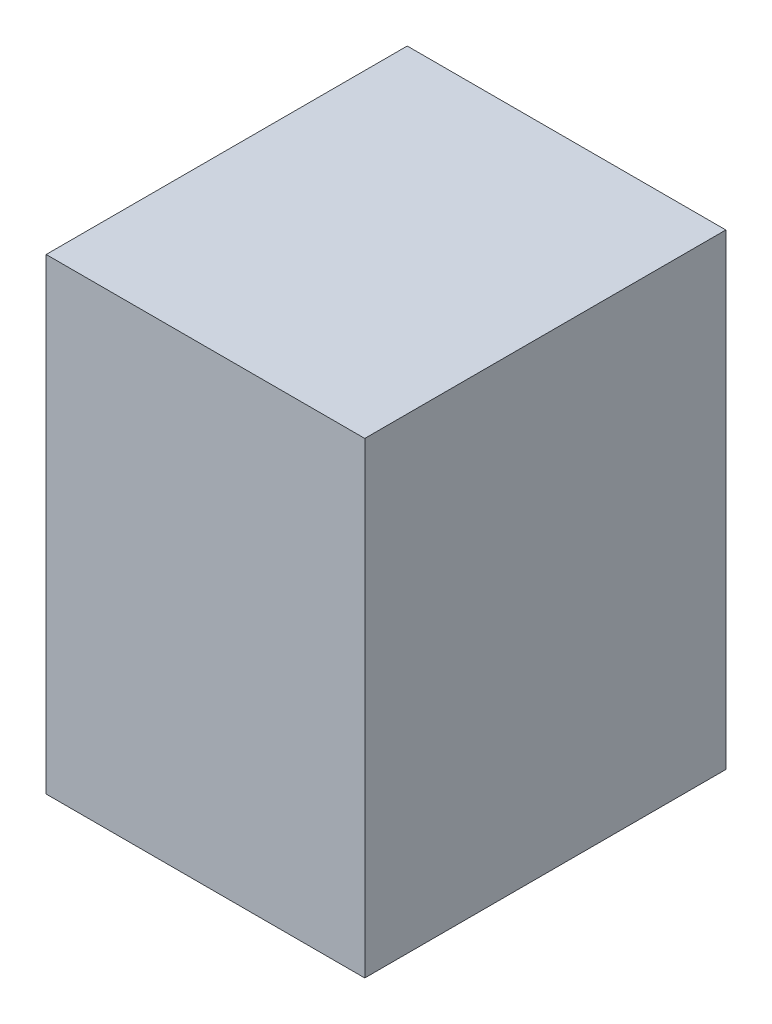
ISO-10303-21;
HEADER;
FILE_DESCRIPTION(('STEP AP214'),'2;1');
FILE_NAME('part.step','',(''),(''),'','','');
FILE_SCHEMA(('AUTOMOTIVE_DESIGN { 1 0 10303 214 1 1 1 1 }'));
ENDSEC;
DATA;
#1=APPLICATION_CONTEXT('core data for automotive mechanical design processes');
#2=APPLICATION_PROTOCOL_DEFINITION('international standard','automotive_design',2000,#1);
#3=PRODUCT_CONTEXT('',#1,'mechanical');
#4=PRODUCT('Part','Part','',(#3));
#5=PRODUCT_RELATED_PRODUCT_CATEGORY('part','',(#4));
#6=PRODUCT_DEFINITION_FORMATION('','',#4);
#7=PRODUCT_DEFINITION_CONTEXT('part definition',#1,'design');
#8=PRODUCT_DEFINITION('design','',#6,#7);
#9=PRODUCT_DEFINITION_SHAPE('','',#8);
#10=(LENGTH_UNIT() NAMED_UNIT(*) SI_UNIT(.MILLI.,.METRE.));
#11=(NAMED_UNIT(*) PLANE_ANGLE_UNIT() SI_UNIT($,.RADIAN.));
#12=(NAMED_UNIT(*) SI_UNIT($,.STERADIAN.) SOLID_ANGLE_UNIT());
#13=UNCERTAINTY_MEASURE_WITH_UNIT(LENGTH_MEASURE(1.E-05),#10,'distance_accuracy_value','');
#14=(GEOMETRIC_REPRESENTATION_CONTEXT(3) GLOBAL_UNCERTAINTY_ASSIGNED_CONTEXT((#13)) GLOBAL_UNIT_ASSIGNED_CONTEXT((#10,
#11,#12)) REPRESENTATION_CONTEXT('',''));
#15=CARTESIAN_POINT('',(0.,0.,0.));
#16=DIRECTION('',(0.,0.,1.));
#17=DIRECTION('',(1.,0.,0.));
#18=AXIS2_PLACEMENT_3D('',#15,#16,#17);
#19=CARTESIAN_POINT('',(38.1,55.88,14.6419390581718));
#20=DIRECTION('',(0.,0.,-1.));
#21=DIRECTION('',(0.,1.,0.));
#22=AXIS2_PLACEMENT_3D('',#19,#20,#21);
#23=PLANE('',#22);
#24=DIRECTION('',(0.,-1.,0.));
#25=VECTOR('',#24,1.);
#26=CARTESIAN_POINT('',(0.,55.88,14.6419390581718));
#27=LINE('',#26,#25);
#28=CARTESIAN_POINT('',(0.,55.88,14.6419390581718));
#29=VERTEX_POINT('',#28);
#30=CARTESIAN_POINT('',(0.,0.,14.6419390581718));
#31=VERTEX_POINT('',#30);
#32=EDGE_CURVE('E100',#29,#31,#27,.T.);
#33=ORIENTED_EDGE('',*,*,#32,.T.);
#34=DIRECTION('',(-1.,0.,0.));
#35=VECTOR('',#34,1.);
#36=CARTESIAN_POINT('',(38.1,0.,14.6419390581718));
#37=LINE('',#36,#35);
#38=CARTESIAN_POINT('',(38.1,0.,14.6419390581718));
#39=VERTEX_POINT('',#38);
#40=EDGE_CURVE('E11',#39,#31,#37,.T.);
#41=ORIENTED_EDGE('',*,*,#40,.F.);
#42=DIRECTION('',(0.,-1.,0.));
#43=VECTOR('',#42,1.);
#44=CARTESIAN_POINT('',(38.1,55.88,14.6419390581718));
#45=LINE('',#44,#43);
#46=CARTESIAN_POINT('',(38.1,55.88,14.6419390581718));
#47=VERTEX_POINT('',#46);
#48=EDGE_CURVE('E88',#47,#39,#45,.T.);
#49=ORIENTED_EDGE('',*,*,#48,.F.);
#50=DIRECTION('',(-1.,0.,0.));
#51=VECTOR('',#50,1.);
#52=CARTESIAN_POINT('',(38.1,55.88,14.6419390581718));
#53=LINE('',#52,#51);
#54=EDGE_CURVE('E96',#47,#29,#53,.T.);
#55=ORIENTED_EDGE('',*,*,#54,.T.);
#56=EDGE_LOOP('',(#33,#41,#49,#55));
#57=FACE_BOUND('',#56,.T.);
#58=ADVANCED_FACE('F37',(#57),#23,.F.);
#59=CARTESIAN_POINT('',(38.1,0.,14.6419390581718));
#60=DIRECTION('',(0.,1.,0.));
#61=DIRECTION('',(0.,0.,1.));
#62=AXIS2_PLACEMENT_3D('',#59,#60,#61);
#63=PLANE('',#62);
#64=DIRECTION('',(0.,0.,-1.));
#65=VECTOR('',#64,1.);
#66=CARTESIAN_POINT('',(0.,0.,14.6419390581718));
#67=LINE('',#66,#65);
#68=CARTESIAN_POINT('',(0.,0.,-28.5380609418282));
#69=VERTEX_POINT('',#68);
#70=EDGE_CURVE('E92',#31,#69,#67,.T.);
#71=ORIENTED_EDGE('',*,*,#70,.T.);
#72=DIRECTION('',(-1.,0.,0.));
#73=VECTOR('',#72,1.);
#74=CARTESIAN_POINT('',(38.1,0.,-28.5380609418282));
#75=LINE('',#74,#73);
#76=CARTESIAN_POINT('',(38.1,0.,-28.5380609418282));
#77=VERTEX_POINT('',#76);
#78=EDGE_CURVE('E45',#77,#69,#75,.T.);
#79=ORIENTED_EDGE('',*,*,#78,.F.);
#80=DIRECTION('',(0.,0.,-1.));
#81=VECTOR('',#80,1.);
#82=CARTESIAN_POINT('',(38.1,0.,14.6419390581718));
#83=LINE('',#82,#81);
#84=EDGE_CURVE('E83',#39,#77,#83,.T.);
#85=ORIENTED_EDGE('',*,*,#84,.F.);
#86=ORIENTED_EDGE('',*,*,#40,.T.);
#87=EDGE_LOOP('',(#71,#79,#85,#86));
#88=FACE_BOUND('',#87,.T.);
#89=ADVANCED_FACE('F91',(#88),#63,.F.);
#90=CARTESIAN_POINT('',(38.1,55.88,-28.5380609418282));
#91=DIRECTION('',(0.,0.,1.));
#92=DIRECTION('',(0.,-1.,0.));
#93=AXIS2_PLACEMENT_3D('',#90,#91,#92);
#94=PLANE('',#93);
#95=DIRECTION('',(0.,1.,0.));
#96=VECTOR('',#95,1.);
#97=CARTESIAN_POINT('',(0.,55.88,-28.5380609418282));
#98=LINE('',#97,#96);
#99=CARTESIAN_POINT('',(0.,55.88,-28.5380609418282));
#100=VERTEX_POINT('',#99);
#101=EDGE_CURVE('E70',#69,#100,#98,.T.);
#102=ORIENTED_EDGE('',*,*,#101,.T.);
#103=DIRECTION('',(-1.,0.,0.));
#104=VECTOR('',#103,1.);
#105=CARTESIAN_POINT('',(38.1,55.88,-28.5380609418282));
#106=LINE('',#105,#104);
#107=CARTESIAN_POINT('',(38.1,55.88,-28.5380609418282));
#108=VERTEX_POINT('',#107);
#109=EDGE_CURVE('E93',#108,#100,#106,.T.);
#110=ORIENTED_EDGE('',*,*,#109,.F.);
#111=DIRECTION('',(0.,1.,0.));
#112=VECTOR('',#111,1.);
#113=CARTESIAN_POINT('',(38.1,55.88,-28.5380609418282));
#114=LINE('',#113,#112);
#115=EDGE_CURVE('E86',#77,#108,#114,.T.);
#116=ORIENTED_EDGE('',*,*,#115,.F.);
#117=ORIENTED_EDGE('',*,*,#78,.T.);
#118=EDGE_LOOP('',(#102,#110,#116,#117));
#119=FACE_BOUND('',#118,.T.);
#120=ADVANCED_FACE('F94',(#119),#94,.F.);
#121=CARTESIAN_POINT('',(38.1,55.88,14.6419390581718));
#122=DIRECTION('',(0.,-1.,0.));
#123=DIRECTION('',(0.,0.,-1.));
#124=AXIS2_PLACEMENT_3D('',#121,#122,#123);
#125=PLANE('',#124);
#126=DIRECTION('',(0.,0.,1.));
#127=VECTOR('',#126,1.);
#128=CARTESIAN_POINT('',(0.,55.88,14.6419390581718));
#129=LINE('',#128,#127);
#130=EDGE_CURVE('E76',#100,#29,#129,.T.);
#131=ORIENTED_EDGE('',*,*,#130,.T.);
#132=ORIENTED_EDGE('',*,*,#54,.F.);
#133=DIRECTION('',(0.,0.,1.));
#134=VECTOR('',#133,1.);
#135=CARTESIAN_POINT('',(38.1,55.88,14.6419390581718));
#136=LINE('',#135,#134);
#137=EDGE_CURVE('E53',#108,#47,#136,.T.);
#138=ORIENTED_EDGE('',*,*,#137,.F.);
#139=ORIENTED_EDGE('',*,*,#109,.T.);
#140=EDGE_LOOP('',(#131,#132,#138,#139));
#141=FACE_BOUND('',#140,.T.);
#142=ADVANCED_FACE('F107',(#141),#125,.F.);
#143=CARTESIAN_POINT('',(38.1,0.,0.));
#144=DIRECTION('',(1.,0.,0.));
#145=DIRECTION('',(0.,0.,-1.));
#146=AXIS2_PLACEMENT_3D('',#143,#144,#145);
#147=PLANE('',#146);
#148=ORIENTED_EDGE('',*,*,#48,.T.);
#149=ORIENTED_EDGE('',*,*,#84,.T.);
#150=ORIENTED_EDGE('',*,*,#115,.T.);
#151=ORIENTED_EDGE('',*,*,#137,.T.);
#152=EDGE_LOOP('',(#148,#149,#150,#151));
#153=FACE_BOUND('',#152,.T.);
#154=ADVANCED_FACE('F84',(#153),#147,.T.);
#155=CARTESIAN_POINT('',(0.,0.,0.));
#156=DIRECTION('',(1.,0.,0.));
#157=DIRECTION('',(0.,0.,-1.));
#158=AXIS2_PLACEMENT_3D('',#155,#156,#157);
#159=PLANE('',#158);
#160=ORIENTED_EDGE('',*,*,#32,.F.);
#161=ORIENTED_EDGE('',*,*,#130,.F.);
#162=ORIENTED_EDGE('',*,*,#101,.F.);
#163=ORIENTED_EDGE('',*,*,#70,.F.);
#164=EDGE_LOOP('',(#160,#161,#162,#163));
#165=FACE_BOUND('',#164,.T.);
#166=ADVANCED_FACE('F110',(#165),#159,.F.);
#167=CLOSED_SHELL('',(#58,#89,#120,#142,#154,#166));
#168=MANIFOLD_SOLID_BREP('B2',#167);
#169=ADVANCED_BREP_SHAPE_REPRESENTATION('',(#18,#168),#14);
#170=SHAPE_DEFINITION_REPRESENTATION(#9,#169);
ENDSEC;
END-ISO-10303-21;
